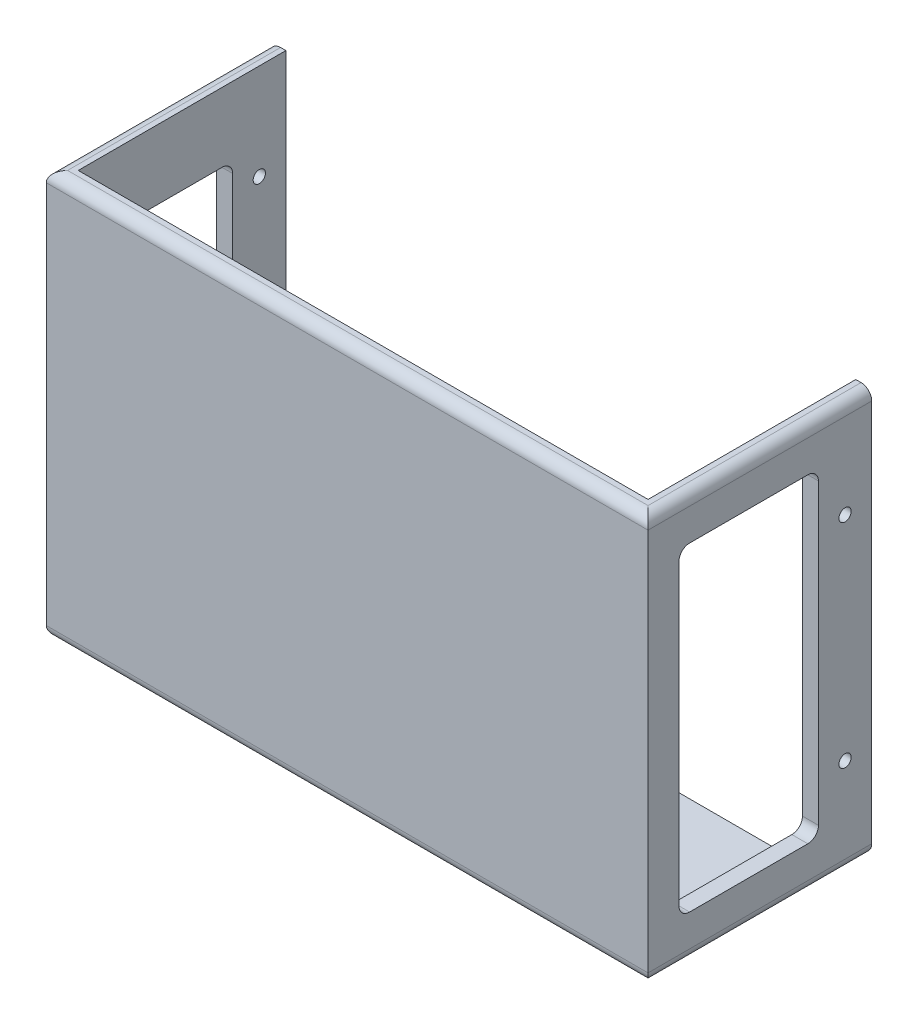
ISO-10303-21;
HEADER;
FILE_DESCRIPTION(('STEP AP214'),'2;1');
FILE_NAME('part.step','',(''),(''),'','','');
FILE_SCHEMA(('AUTOMOTIVE_DESIGN { 1 0 10303 214 1 1 1 1 }'));
ENDSEC;
DATA;
#1=APPLICATION_CONTEXT('core data for automotive mechanical design processes');
#2=APPLICATION_PROTOCOL_DEFINITION('international standard','automotive_design',2000,#1);
#3=PRODUCT_CONTEXT('',#1,'mechanical');
#4=PRODUCT('Part','Part','',(#3));
#5=PRODUCT_RELATED_PRODUCT_CATEGORY('part','',(#4));
#6=PRODUCT_DEFINITION_FORMATION('','',#4);
#7=PRODUCT_DEFINITION_CONTEXT('part definition',#1,'design');
#8=PRODUCT_DEFINITION('design','',#6,#7);
#9=PRODUCT_DEFINITION_SHAPE('','',#8);
#10=(LENGTH_UNIT() NAMED_UNIT(*) SI_UNIT(.MILLI.,.METRE.));
#11=(NAMED_UNIT(*) PLANE_ANGLE_UNIT() SI_UNIT($,.RADIAN.));
#12=(NAMED_UNIT(*) SI_UNIT($,.STERADIAN.) SOLID_ANGLE_UNIT());
#13=UNCERTAINTY_MEASURE_WITH_UNIT(LENGTH_MEASURE(1.E-05),#10,'distance_accuracy_value','');
#14=(GEOMETRIC_REPRESENTATION_CONTEXT(3) GLOBAL_UNCERTAINTY_ASSIGNED_CONTEXT((#13)) GLOBAL_UNIT_ASSIGNED_CONTEXT((#10,
#11,#12)) REPRESENTATION_CONTEXT('',''));
#15=CARTESIAN_POINT('',(0.,0.,0.));
#16=DIRECTION('',(0.,0.,1.));
#17=DIRECTION('',(1.,0.,0.));
#18=AXIS2_PLACEMENT_3D('',#15,#16,#17);
#19=CARTESIAN_POINT('',(-53.5,-35.,40.));
#20=DIRECTION('',(0.,1.,0.));
#21=DIRECTION('',(0.,0.,1.));
#22=AXIS2_PLACEMENT_3D('',#19,#20,#21);
#23=PLANE('',#22);
#24=DIRECTION('',(0.,0.,-1.));
#25=VECTOR('',#24,1.);
#26=CARTESIAN_POINT('',(53.5,-35.,40.));
#27=LINE('',#26,#25);
#28=CARTESIAN_POINT('',(53.5,-35.,39.));
#29=VERTEX_POINT('',#28);
#30=CARTESIAN_POINT('',(53.5,-35.,10.791278804793));
#31=VERTEX_POINT('',#30);
#32=EDGE_CURVE('E381',#29,#31,#27,.T.);
#33=ORIENTED_EDGE('',*,*,#32,.T.);
#34=DIRECTION('',(1.,0.,0.));
#35=VECTOR('',#34,1.);
#36=CARTESIAN_POINT('',(53.5,-35.,10.791278804793));
#37=LINE('',#36,#35);
#38=CARTESIAN_POINT('',(-53.5,-35.,10.791278804793));
#39=VERTEX_POINT('',#38);
#40=EDGE_CURVE('E266',#39,#31,#37,.T.);
#41=ORIENTED_EDGE('',*,*,#40,.F.);
#42=DIRECTION('',(0.,0.,-1.));
#43=VECTOR('',#42,1.);
#44=CARTESIAN_POINT('',(-53.5,-35.,40.));
#45=LINE('',#44,#43);
#46=CARTESIAN_POINT('',(-53.5,-35.,39.));
#47=VERTEX_POINT('',#46);
#48=EDGE_CURVE('E384',#47,#39,#45,.T.);
#49=ORIENTED_EDGE('',*,*,#48,.F.);
#50=DIRECTION('',(-1.,0.,0.));
#51=VECTOR('',#50,1.);
#52=CARTESIAN_POINT('',(-53.5,-35.,39.));
#53=LINE('',#52,#51);
#54=EDGE_CURVE('E296',#29,#47,#53,.T.);
#55=ORIENTED_EDGE('',*,*,#54,.F.);
#56=EDGE_LOOP('',(#33,#41,#49,#55));
#57=FACE_BOUND('',#56,.T.);
#58=ADVANCED_FACE('F46',(#57),#23,.T.);
#59=CARTESIAN_POINT('',(-56.5,-38.,40.));
#60=DIRECTION('',(1.,0.,0.));
#61=DIRECTION('',(0.,0.,-1.));
#62=AXIS2_PLACEMENT_3D('',#59,#60,#61);
#63=PLANE('',#62);
#64=CARTESIAN_POINT('',(-56.5,20.,5.));
#65=DIRECTION('',(1.,0.,0.));
#66=DIRECTION('',(0.,0.,-1.));
#67=AXIS2_PLACEMENT_3D('',#64,#65,#66);
#68=CIRCLE('',#67,1.15);
#69=CARTESIAN_POINT('',(-56.5,20.,3.85));
#70=VERTEX_POINT('',#69);
#71=EDGE_CURVE('E570',#70,#70,#68,.T.);
#72=ORIENTED_EDGE('',*,*,#71,.T.);
#73=EDGE_LOOP('',(#72));
#74=FACE_BOUND('',#73,.T.);
#75=CARTESIAN_POINT('',(-56.5,-20.,5.));
#76=DIRECTION('',(1.,0.,0.));
#77=DIRECTION('',(0.,0.,-1.));
#78=AXIS2_PLACEMENT_3D('',#75,#76,#77);
#79=CIRCLE('',#78,1.15);
#80=CARTESIAN_POINT('',(-56.5,-20.,3.85));
#81=VERTEX_POINT('',#80);
#82=EDGE_CURVE('E590',#81,#81,#79,.T.);
#83=ORIENTED_EDGE('',*,*,#82,.T.);
#84=EDGE_LOOP('',(#83));
#85=FACE_BOUND('',#84,.T.);
#86=DIRECTION('',(0.,1.,0.));
#87=VECTOR('',#86,1.);
#88=CARTESIAN_POINT('',(-56.5,38.,39.));
#89=LINE('',#88,#87);
#90=CARTESIAN_POINT('',(-56.5,-23.,39.));
#91=VERTEX_POINT('',#90);
#92=CARTESIAN_POINT('',(-56.5,23.,39.));
#93=VERTEX_POINT('',#92);
#94=EDGE_CURVE('E283',#91,#93,#89,.T.);
#95=ORIENTED_EDGE('',*,*,#94,.F.);
#96=CARTESIAN_POINT('',(-56.5,-23.,37.));
#97=DIRECTION('',(1.,0.,0.));
#98=DIRECTION('',(0.,0.,-1.));
#99=AXIS2_PLACEMENT_3D('',#96,#97,#98);
#100=CIRCLE('',#99,2.);
#101=CARTESIAN_POINT('',(-56.5,-25.,37.));
#102=VERTEX_POINT('',#101);
#103=EDGE_CURVE('E11',#91,#102,#100,.T.);
#104=ORIENTED_EDGE('',*,*,#103,.T.);
#105=DIRECTION('',(0.,0.,1.));
#106=VECTOR('',#105,1.);
#107=CARTESIAN_POINT('',(-56.5,-25.,0.));
#108=LINE('',#107,#106);
#109=CARTESIAN_POINT('',(-56.5,-25.,12.));
#110=VERTEX_POINT('',#109);
#111=EDGE_CURVE('E313',#110,#102,#108,.T.);
#112=ORIENTED_EDGE('',*,*,#111,.F.);
#113=CARTESIAN_POINT('',(-56.5,-23.,12.));
#114=DIRECTION('',(1.,0.,0.));
#115=DIRECTION('',(0.,0.,-1.));
#116=AXIS2_PLACEMENT_3D('',#113,#114,#115);
#117=CIRCLE('',#116,2.);
#118=CARTESIAN_POINT('',(-56.5,-23.,10.));
#119=VERTEX_POINT('',#118);
#120=EDGE_CURVE('E543',#110,#119,#117,.T.);
#121=ORIENTED_EDGE('',*,*,#120,.T.);
#122=DIRECTION('',(0.,-1.,0.));
#123=VECTOR('',#122,1.);
#124=CARTESIAN_POINT('',(-56.5,0.,10.));
#125=LINE('',#124,#123);
#126=CARTESIAN_POINT('',(-56.5,23.,10.));
#127=VERTEX_POINT('',#126);
#128=EDGE_CURVE('E325',#127,#119,#125,.T.);
#129=ORIENTED_EDGE('',*,*,#128,.F.);
#130=CARTESIAN_POINT('',(-56.5,23.,12.));
#131=DIRECTION('',(1.,0.,0.));
#132=DIRECTION('',(0.,0.,-1.));
#133=AXIS2_PLACEMENT_3D('',#130,#131,#132);
#134=CIRCLE('',#133,2.);
#135=CARTESIAN_POINT('',(-56.5,25.,12.));
#136=VERTEX_POINT('',#135);
#137=EDGE_CURVE('E531',#127,#136,#134,.T.);
#138=ORIENTED_EDGE('',*,*,#137,.T.);
#139=DIRECTION('',(0.,0.,1.));
#140=VECTOR('',#139,1.);
#141=CARTESIAN_POINT('',(-56.5,25.,0.));
#142=LINE('',#141,#140);
#143=CARTESIAN_POINT('',(-56.5,25.,37.));
#144=VERTEX_POINT('',#143);
#145=EDGE_CURVE('E307',#136,#144,#142,.T.);
#146=ORIENTED_EDGE('',*,*,#145,.T.);
#147=CARTESIAN_POINT('',(-56.5,23.,37.));
#148=DIRECTION('',(1.,0.,0.));
#149=DIRECTION('',(0.,0.,-1.));
#150=AXIS2_PLACEMENT_3D('',#147,#148,#149);
#151=CIRCLE('',#150,2.);
#152=EDGE_CURVE('E540',#144,#93,#151,.T.);
#153=ORIENTED_EDGE('',*,*,#152,.T.);
#154=EDGE_LOOP('',(#95,#104,#112,#121,#129,#138,#146,#153));
#155=FACE_BOUND('',#154,.T.);
#156=DIRECTION('',(0.,-1.,0.));
#157=VECTOR('',#156,1.);
#158=CARTESIAN_POINT('',(-56.5,38.,42.));
#159=LINE('',#158,#157);
#160=CARTESIAN_POINT('',(-56.5,36.,42.));
#161=VERTEX_POINT('',#160);
#162=CARTESIAN_POINT('',(-56.5,-36.,42.));
#163=VERTEX_POINT('',#162);
#164=EDGE_CURVE('E367',#161,#163,#159,.T.);
#165=ORIENTED_EDGE('',*,*,#164,.F.);
#166=DIRECTION('',(0.,0.,-1.));
#167=VECTOR('',#166,1.);
#168=CARTESIAN_POINT('',(-56.5,36.,40.));
#169=LINE('',#168,#167);
#170=CARTESIAN_POINT('',(-56.5,36.,0.));
#171=VERTEX_POINT('',#170);
#172=EDGE_CURVE('E491',#161,#171,#169,.T.);
#173=ORIENTED_EDGE('',*,*,#172,.T.);
#174=DIRECTION('',(0.,-1.,0.));
#175=VECTOR('',#174,1.);
#176=CARTESIAN_POINT('',(-56.5,-38.,0.));
#177=LINE('',#176,#175);
#178=CARTESIAN_POINT('',(-56.5,-36.,0.));
#179=VERTEX_POINT('',#178);
#180=EDGE_CURVE('E388',#171,#179,#177,.T.);
#181=ORIENTED_EDGE('',*,*,#180,.T.);
#182=DIRECTION('',(0.,0.,-1.));
#183=VECTOR('',#182,1.);
#184=CARTESIAN_POINT('',(-56.5,-36.,40.));
#185=LINE('',#184,#183);
#186=EDGE_CURVE('E488',#179,#163,#185,.F.);
#187=ORIENTED_EDGE('',*,*,#186,.T.);
#188=EDGE_LOOP('',(#165,#173,#181,#187));
#189=FACE_BOUND('',#188,.T.);
#190=ADVANCED_FACE('F685',(#74,#85,#155,#189),#63,.F.);
#191=CARTESIAN_POINT('',(0.,0.,0.));
#192=DIRECTION('',(0.,0.,-1.));
#193=DIRECTION('',(-1.,0.,0.));
#194=AXIS2_PLACEMENT_3D('',#191,#192,#193);
#195=PLANE('',#194);
#196=ORIENTED_EDGE('',*,*,#180,.F.);
#197=CARTESIAN_POINT('',(-54.5,36.,0.));
#198=DIRECTION('',(0.,0.,-1.));
#199=DIRECTION('',(-1.,0.,0.));
#200=AXIS2_PLACEMENT_3D('',#197,#198,#199);
#201=CIRCLE('',#200,2.);
#202=CARTESIAN_POINT('',(-54.5,38.,0.));
#203=VERTEX_POINT('',#202);
#204=EDGE_CURVE('E497',#171,#203,#201,.T.);
#205=ORIENTED_EDGE('',*,*,#204,.T.);
#206=DIRECTION('',(-1.,0.,0.));
#207=VECTOR('',#206,1.);
#208=CARTESIAN_POINT('',(-56.5,38.,0.));
#209=LINE('',#208,#207);
#210=CARTESIAN_POINT('',(-53.5,38.,0.));
#211=VERTEX_POINT('',#210);
#212=EDGE_CURVE('E400',#211,#203,#209,.T.);
#213=ORIENTED_EDGE('',*,*,#212,.F.);
#214=DIRECTION('',(0.,-1.,0.));
#215=VECTOR('',#214,1.);
#216=CARTESIAN_POINT('',(-53.5,-35.,0.));
#217=LINE('',#216,#215);
#218=CARTESIAN_POINT('',(-53.5,-38.,0.));
#219=VERTEX_POINT('',#218);
#220=EDGE_CURVE('E377',#211,#219,#217,.T.);
#221=ORIENTED_EDGE('',*,*,#220,.T.);
#222=DIRECTION('',(1.,0.,0.));
#223=VECTOR('',#222,1.);
#224=CARTESIAN_POINT('',(-56.5,-38.,0.));
#225=LINE('',#224,#223);
#226=CARTESIAN_POINT('',(-54.5,-38.,0.));
#227=VERTEX_POINT('',#226);
#228=EDGE_CURVE('E393',#227,#219,#225,.T.);
#229=ORIENTED_EDGE('',*,*,#228,.F.);
#230=CARTESIAN_POINT('',(-54.5,-36.,0.));
#231=DIRECTION('',(0.,0.,-1.));
#232=DIRECTION('',(-1.,0.,0.));
#233=AXIS2_PLACEMENT_3D('',#230,#231,#232);
#234=CIRCLE('',#233,2.);
#235=EDGE_CURVE('E494',#227,#179,#234,.T.);
#236=ORIENTED_EDGE('',*,*,#235,.T.);
#237=EDGE_LOOP('',(#196,#205,#213,#221,#229,#236));
#238=FACE_BOUND('',#237,.T.);
#239=ADVANCED_FACE('F647',(#238),#195,.T.);
#240=CARTESIAN_POINT('',(56.5,-38.,40.));
#241=DIRECTION('',(-1.,0.,0.));
#242=DIRECTION('',(0.,0.,1.));
#243=AXIS2_PLACEMENT_3D('',#240,#241,#242);
#244=PLANE('',#243);
#245=CARTESIAN_POINT('',(56.5,20.,5.));
#246=DIRECTION('',(1.,0.,0.));
#247=DIRECTION('',(0.,0.,-1.));
#248=AXIS2_PLACEMENT_3D('',#245,#246,#247);
#249=CIRCLE('',#248,1.15);
#250=CARTESIAN_POINT('',(56.5,20.,3.85));
#251=VERTEX_POINT('',#250);
#252=EDGE_CURVE('E578',#251,#251,#249,.T.);
#253=ORIENTED_EDGE('',*,*,#252,.F.);
#254=EDGE_LOOP('',(#253));
#255=FACE_BOUND('',#254,.T.);
#256=CARTESIAN_POINT('',(56.5,-20.,5.));
#257=DIRECTION('',(1.,0.,0.));
#258=DIRECTION('',(0.,0.,-1.));
#259=AXIS2_PLACEMENT_3D('',#256,#257,#258);
#260=CIRCLE('',#259,1.15);
#261=CARTESIAN_POINT('',(56.5,-20.,3.85));
#262=VERTEX_POINT('',#261);
#263=EDGE_CURVE('E584',#262,#262,#260,.T.);
#264=ORIENTED_EDGE('',*,*,#263,.F.);
#265=EDGE_LOOP('',(#264));
#266=FACE_BOUND('',#265,.T.);
#267=DIRECTION('',(0.,-1.,0.));
#268=VECTOR('',#267,1.);
#269=CARTESIAN_POINT('',(56.5,0.,36.200451213477));
#270=LINE('',#269,#268);
#271=CARTESIAN_POINT('',(56.5,28.,36.200451213477));
#272=VERTEX_POINT('',#271);
#273=CARTESIAN_POINT('',(56.5,-28.,36.200451213477));
#274=VERTEX_POINT('',#273);
#275=EDGE_CURVE('E352',#272,#274,#270,.T.);
#276=ORIENTED_EDGE('',*,*,#275,.F.);
#277=CARTESIAN_POINT('',(56.5,28.,34.200451213477));
#278=DIRECTION('',(-1.,0.,0.));
#279=DIRECTION('',(0.,0.,1.));
#280=AXIS2_PLACEMENT_3D('',#277,#278,#279);
#281=CIRCLE('',#280,2.);
#282=CARTESIAN_POINT('',(56.5,30.,34.200451213477));
#283=VERTEX_POINT('',#282);
#284=EDGE_CURVE('E513',#272,#283,#281,.T.);
#285=ORIENTED_EDGE('',*,*,#284,.T.);
#286=DIRECTION('',(0.,0.,1.));
#287=VECTOR('',#286,1.);
#288=CARTESIAN_POINT('',(56.5,30.,0.));
#289=LINE('',#288,#287);
#290=CARTESIAN_POINT('',(56.5,30.,12.));
#291=VERTEX_POINT('',#290);
#292=EDGE_CURVE('E321',#291,#283,#289,.T.);
#293=ORIENTED_EDGE('',*,*,#292,.F.);
#294=CARTESIAN_POINT('',(56.5,28.,12.));
#295=DIRECTION('',(-1.,0.,0.));
#296=DIRECTION('',(0.,0.,1.));
#297=AXIS2_PLACEMENT_3D('',#294,#295,#296);
#298=CIRCLE('',#297,2.);
#299=CARTESIAN_POINT('',(56.5,28.,10.));
#300=VERTEX_POINT('',#299);
#301=EDGE_CURVE('E507',#291,#300,#298,.T.);
#302=ORIENTED_EDGE('',*,*,#301,.T.);
#303=DIRECTION('',(0.,-1.,0.));
#304=VECTOR('',#303,1.);
#305=CARTESIAN_POINT('',(56.5,0.,10.));
#306=LINE('',#305,#304);
#307=CARTESIAN_POINT('',(56.5,-28.,9.99999999999999));
#308=VERTEX_POINT('',#307);
#309=EDGE_CURVE('E337',#300,#308,#306,.T.);
#310=ORIENTED_EDGE('',*,*,#309,.T.);
#311=CARTESIAN_POINT('',(56.5,-28.,12.));
#312=DIRECTION('',(-1.,0.,0.));
#313=DIRECTION('',(0.,0.,1.));
#314=AXIS2_PLACEMENT_3D('',#311,#312,#313);
#315=CIRCLE('',#314,2.);
#316=CARTESIAN_POINT('',(56.5,-30.,12.));
#317=VERTEX_POINT('',#316);
#318=EDGE_CURVE('E525',#308,#317,#315,.T.);
#319=ORIENTED_EDGE('',*,*,#318,.T.);
#320=DIRECTION('',(0.,0.,1.));
#321=VECTOR('',#320,1.);
#322=CARTESIAN_POINT('',(56.5,-30.,0.));
#323=LINE('',#322,#321);
#324=CARTESIAN_POINT('',(56.5,-30.,34.200451213477));
#325=VERTEX_POINT('',#324);
#326=EDGE_CURVE('E356',#317,#325,#323,.T.);
#327=ORIENTED_EDGE('',*,*,#326,.T.);
#328=CARTESIAN_POINT('',(56.5,-28.,34.200451213477));
#329=DIRECTION('',(-1.,0.,0.));
#330=DIRECTION('',(0.,0.,1.));
#331=AXIS2_PLACEMENT_3D('',#328,#329,#330);
#332=CIRCLE('',#331,2.);
#333=EDGE_CURVE('E519',#325,#274,#332,.T.);
#334=ORIENTED_EDGE('',*,*,#333,.T.);
#335=EDGE_LOOP('',(#276,#285,#293,#302,#310,#319,#327,#334));
#336=FACE_BOUND('',#335,.T.);
#337=DIRECTION('',(0.,1.,0.));
#338=VECTOR('',#337,1.);
#339=CARTESIAN_POINT('',(56.5,-38.,0.));
#340=LINE('',#339,#338);
#341=CARTESIAN_POINT('',(56.5,-36.,0.));
#342=VERTEX_POINT('',#341);
#343=CARTESIAN_POINT('',(56.5,36.,0.));
#344=VERTEX_POINT('',#343);
#345=EDGE_CURVE('E396',#342,#344,#340,.T.);
#346=ORIENTED_EDGE('',*,*,#345,.T.);
#347=DIRECTION('',(0.,0.,-1.));
#348=VECTOR('',#347,1.);
#349=CARTESIAN_POINT('',(56.5,36.,40.));
#350=LINE('',#349,#348);
#351=CARTESIAN_POINT('',(56.5,36.,42.));
#352=VERTEX_POINT('',#351);
#353=EDGE_CURVE('E485',#344,#352,#350,.F.);
#354=ORIENTED_EDGE('',*,*,#353,.T.);
#355=DIRECTION('',(0.,1.,0.));
#356=VECTOR('',#355,1.);
#357=CARTESIAN_POINT('',(56.5,38.,42.));
#358=LINE('',#357,#356);
#359=CARTESIAN_POINT('',(56.5,-36.,42.));
#360=VERTEX_POINT('',#359);
#361=EDGE_CURVE('E371',#360,#352,#358,.T.);
#362=ORIENTED_EDGE('',*,*,#361,.F.);
#363=DIRECTION('',(0.,0.,-1.));
#364=VECTOR('',#363,1.);
#365=CARTESIAN_POINT('',(56.5,-36.,40.));
#366=LINE('',#365,#364);
#367=EDGE_CURVE('E482',#360,#342,#366,.T.);
#368=ORIENTED_EDGE('',*,*,#367,.T.);
#369=EDGE_LOOP('',(#346,#354,#362,#368));
#370=FACE_BOUND('',#369,.T.);
#371=ADVANCED_FACE('F632',(#255,#266,#336,#370),#244,.F.);
#372=CARTESIAN_POINT('',(53.5,-35.,40.));
#373=DIRECTION('',(-1.,0.,0.));
#374=DIRECTION('',(0.,0.,1.));
#375=AXIS2_PLACEMENT_3D('',#372,#373,#374);
#376=PLANE('',#375);
#377=CARTESIAN_POINT('',(53.5,20.,5.));
#378=DIRECTION('',(-1.,0.,0.));
#379=DIRECTION('',(0.,0.,1.));
#380=AXIS2_PLACEMENT_3D('',#377,#378,#379);
#381=CIRCLE('',#380,1.15);
#382=CARTESIAN_POINT('',(53.5,20.,6.15));
#383=VERTEX_POINT('',#382);
#384=EDGE_CURVE('E563',#383,#383,#381,.T.);
#385=ORIENTED_EDGE('',*,*,#384,.F.);
#386=EDGE_LOOP('',(#385));
#387=FACE_BOUND('',#386,.T.);
#388=CARTESIAN_POINT('',(53.5,-20.,5.));
#389=DIRECTION('',(-1.,0.,0.));
#390=DIRECTION('',(0.,0.,1.));
#391=AXIS2_PLACEMENT_3D('',#388,#389,#390);
#392=CIRCLE('',#391,1.15);
#393=CARTESIAN_POINT('',(53.5,-20.,6.15));
#394=VERTEX_POINT('',#393);
#395=EDGE_CURVE('E569',#394,#394,#392,.T.);
#396=ORIENTED_EDGE('',*,*,#395,.F.);
#397=EDGE_LOOP('',(#396));
#398=FACE_BOUND('',#397,.T.);
#399=DIRECTION('',(0.,-1.,0.));
#400=VECTOR('',#399,1.);
#401=CARTESIAN_POINT('',(53.5,-35.,39.));
#402=LINE('',#401,#400);
#403=CARTESIAN_POINT('',(53.5,38.,39.));
#404=VERTEX_POINT('',#403);
#405=EDGE_CURVE('E300',#404,#29,#402,.T.);
#406=ORIENTED_EDGE('',*,*,#405,.F.);
#407=DIRECTION('',(0.,0.,-1.));
#408=VECTOR('',#407,1.);
#409=CARTESIAN_POINT('',(53.5,38.,0.));
#410=LINE('',#409,#408);
#411=CARTESIAN_POINT('',(53.5,38.,0.));
#412=VERTEX_POINT('',#411);
#413=EDGE_CURVE('E304',#404,#412,#410,.T.);
#414=ORIENTED_EDGE('',*,*,#413,.T.);
#415=DIRECTION('',(0.,1.,0.));
#416=VECTOR('',#415,1.);
#417=CARTESIAN_POINT('',(53.5,-35.,0.));
#418=LINE('',#417,#416);
#419=CARTESIAN_POINT('',(53.5,-38.,0.));
#420=VERTEX_POINT('',#419);
#421=EDGE_CURVE('E254',#420,#412,#418,.T.);
#422=ORIENTED_EDGE('',*,*,#421,.F.);
#423=DIRECTION('',(0.,0.,-1.));
#424=VECTOR('',#423,1.);
#425=CARTESIAN_POINT('',(53.5,-38.,0.));
#426=LINE('',#425,#424);
#427=CARTESIAN_POINT('',(53.5,-38.,10.791278804793));
#428=VERTEX_POINT('',#427);
#429=EDGE_CURVE('E245',#428,#420,#426,.T.);
#430=ORIENTED_EDGE('',*,*,#429,.F.);
#431=DIRECTION('',(0.,-1.,0.));
#432=VECTOR('',#431,1.);
#433=CARTESIAN_POINT('',(53.5,-35.,10.791278804793));
#434=LINE('',#433,#432);
#435=EDGE_CURVE('E250',#31,#428,#434,.T.);
#436=ORIENTED_EDGE('',*,*,#435,.F.);
#437=ORIENTED_EDGE('',*,*,#32,.F.);
#438=EDGE_LOOP('',(#406,#414,#422,#430,#436,#437));
#439=FACE_BOUND('',#438,.T.);
#440=DIRECTION('',(0.,-1.,0.));
#441=VECTOR('',#440,1.);
#442=CARTESIAN_POINT('',(53.5,0.,10.));
#443=LINE('',#442,#441);
#444=CARTESIAN_POINT('',(53.5,28.,10.));
#445=VERTEX_POINT('',#444);
#446=CARTESIAN_POINT('',(53.5,-28.,9.99999999999999));
#447=VERTEX_POINT('',#446);
#448=EDGE_CURVE('E345',#445,#447,#443,.T.);
#449=ORIENTED_EDGE('',*,*,#448,.F.);
#450=CARTESIAN_POINT('',(53.5,28.,12.));
#451=DIRECTION('',(-1.,0.,0.));
#452=DIRECTION('',(0.,0.,1.));
#453=AXIS2_PLACEMENT_3D('',#450,#451,#452);
#454=CIRCLE('',#453,2.);
#455=CARTESIAN_POINT('',(53.5,30.,12.));
#456=VERTEX_POINT('',#455);
#457=EDGE_CURVE('E510',#445,#456,#454,.F.);
#458=ORIENTED_EDGE('',*,*,#457,.T.);
#459=DIRECTION('',(0.,0.,1.));
#460=VECTOR('',#459,1.);
#461=CARTESIAN_POINT('',(53.5,30.,0.));
#462=LINE('',#461,#460);
#463=CARTESIAN_POINT('',(53.5,30.,34.200451213477));
#464=VERTEX_POINT('',#463);
#465=EDGE_CURVE('E332',#456,#464,#462,.T.);
#466=ORIENTED_EDGE('',*,*,#465,.T.);
#467=CARTESIAN_POINT('',(53.5,28.,34.200451213477));
#468=DIRECTION('',(-1.,0.,0.));
#469=DIRECTION('',(0.,0.,1.));
#470=AXIS2_PLACEMENT_3D('',#467,#468,#469);
#471=CIRCLE('',#470,2.);
#472=CARTESIAN_POINT('',(53.5,28.,36.200451213477));
#473=VERTEX_POINT('',#472);
#474=EDGE_CURVE('E516',#464,#473,#471,.F.);
#475=ORIENTED_EDGE('',*,*,#474,.T.);
#476=DIRECTION('',(0.,-1.,0.));
#477=VECTOR('',#476,1.);
#478=CARTESIAN_POINT('',(53.5,0.,36.200451213477));
#479=LINE('',#478,#477);
#480=CARTESIAN_POINT('',(53.5,-28.,36.200451213477));
#481=VERTEX_POINT('',#480);
#482=EDGE_CURVE('E336',#473,#481,#479,.T.);
#483=ORIENTED_EDGE('',*,*,#482,.T.);
#484=CARTESIAN_POINT('',(53.5,-28.,34.200451213477));
#485=DIRECTION('',(-1.,0.,0.));
#486=DIRECTION('',(0.,0.,1.));
#487=AXIS2_PLACEMENT_3D('',#484,#485,#486);
#488=CIRCLE('',#487,2.);
#489=CARTESIAN_POINT('',(53.5,-30.,34.200451213477));
#490=VERTEX_POINT('',#489);
#491=EDGE_CURVE('E522',#481,#490,#488,.F.);
#492=ORIENTED_EDGE('',*,*,#491,.T.);
#493=DIRECTION('',(0.,0.,1.));
#494=VECTOR('',#493,1.);
#495=CARTESIAN_POINT('',(53.5,-30.,0.));
#496=LINE('',#495,#494);
#497=CARTESIAN_POINT('',(53.5,-30.,12.));
#498=VERTEX_POINT('',#497);
#499=EDGE_CURVE('E341',#498,#490,#496,.T.);
#500=ORIENTED_EDGE('',*,*,#499,.F.);
#501=CARTESIAN_POINT('',(53.5,-28.,12.));
#502=DIRECTION('',(-1.,0.,0.));
#503=DIRECTION('',(0.,0.,1.));
#504=AXIS2_PLACEMENT_3D('',#501,#502,#503);
#505=CIRCLE('',#504,2.);
#506=EDGE_CURVE('E528',#498,#447,#505,.F.);
#507=ORIENTED_EDGE('',*,*,#506,.T.);
#508=EDGE_LOOP('',(#449,#458,#466,#475,#483,#492,#500,#507));
#509=FACE_BOUND('',#508,.T.);
#510=ADVANCED_FACE('F247',(#387,#398,#439,#509),#376,.T.);
#511=CARTESIAN_POINT('',(-53.5,-35.,40.));
#512=DIRECTION('',(1.,0.,0.));
#513=DIRECTION('',(0.,0.,-1.));
#514=AXIS2_PLACEMENT_3D('',#511,#512,#513);
#515=PLANE('',#514);
#516=CARTESIAN_POINT('',(-53.5,20.,5.));
#517=DIRECTION('',(1.,0.,0.));
#518=DIRECTION('',(0.,0.,-1.));
#519=AXIS2_PLACEMENT_3D('',#516,#517,#518);
#520=CIRCLE('',#519,1.15);
#521=CARTESIAN_POINT('',(-53.5,20.,3.85));
#522=VERTEX_POINT('',#521);
#523=EDGE_CURVE('E50',#522,#522,#520,.T.);
#524=ORIENTED_EDGE('',*,*,#523,.F.);
#525=EDGE_LOOP('',(#524));
#526=FACE_BOUND('',#525,.T.);
#527=CARTESIAN_POINT('',(-53.5,-20.,5.));
#528=DIRECTION('',(1.,0.,0.));
#529=DIRECTION('',(0.,0.,-1.));
#530=AXIS2_PLACEMENT_3D('',#527,#528,#529);
#531=CIRCLE('',#530,1.15);
#532=CARTESIAN_POINT('',(-53.5,-20.,3.85));
#533=VERTEX_POINT('',#532);
#534=EDGE_CURVE('E566',#533,#533,#531,.T.);
#535=ORIENTED_EDGE('',*,*,#534,.F.);
#536=EDGE_LOOP('',(#535));
#537=FACE_BOUND('',#536,.T.);
#538=DIRECTION('',(0.,1.,0.));
#539=VECTOR('',#538,1.);
#540=CARTESIAN_POINT('',(-53.5,-35.,39.));
#541=LINE('',#540,#539);
#542=CARTESIAN_POINT('',(-53.5,-23.,39.));
#543=VERTEX_POINT('',#542);
#544=EDGE_CURVE('E295',#47,#543,#541,.T.);
#545=ORIENTED_EDGE('',*,*,#544,.F.);
#546=ORIENTED_EDGE('',*,*,#48,.T.);
#547=DIRECTION('',(0.,1.,0.));
#548=VECTOR('',#547,1.);
#549=CARTESIAN_POINT('',(-53.5,-35.,10.791278804793));
#550=LINE('',#549,#548);
#551=CARTESIAN_POINT('',(-53.5,-38.,10.791278804793));
#552=VERTEX_POINT('',#551);
#553=EDGE_CURVE('E275',#552,#39,#550,.T.);
#554=ORIENTED_EDGE('',*,*,#553,.F.);
#555=DIRECTION('',(0.,0.,1.));
#556=VECTOR('',#555,1.);
#557=CARTESIAN_POINT('',(-53.5,-38.,0.));
#558=LINE('',#557,#556);
#559=EDGE_CURVE('E259',#219,#552,#558,.T.);
#560=ORIENTED_EDGE('',*,*,#559,.F.);
#561=ORIENTED_EDGE('',*,*,#220,.F.);
#562=DIRECTION('',(0.,0.,-1.));
#563=VECTOR('',#562,1.);
#564=CARTESIAN_POINT('',(-53.5,38.,0.));
#565=LINE('',#564,#563);
#566=CARTESIAN_POINT('',(-53.5,38.,39.));
#567=VERTEX_POINT('',#566);
#568=EDGE_CURVE('E258',#567,#211,#565,.T.);
#569=ORIENTED_EDGE('',*,*,#568,.F.);
#570=CARTESIAN_POINT('',(-53.5,23.,39.));
#571=VERTEX_POINT('',#570);
#572=EDGE_CURVE('E291',#571,#567,#541,.T.);
#573=ORIENTED_EDGE('',*,*,#572,.F.);
#574=CARTESIAN_POINT('',(-53.5,23.,37.));
#575=DIRECTION('',(1.,0.,0.));
#576=DIRECTION('',(0.,0.,-1.));
#577=AXIS2_PLACEMENT_3D('',#574,#575,#576);
#578=CIRCLE('',#577,2.);
#579=CARTESIAN_POINT('',(-53.5,25.,37.));
#580=VERTEX_POINT('',#579);
#581=EDGE_CURVE('E537',#571,#580,#578,.F.);
#582=ORIENTED_EDGE('',*,*,#581,.T.);
#583=DIRECTION('',(0.,0.,1.));
#584=VECTOR('',#583,1.);
#585=CARTESIAN_POINT('',(-53.5,25.,0.));
#586=LINE('',#585,#584);
#587=CARTESIAN_POINT('',(-53.5,25.,12.));
#588=VERTEX_POINT('',#587);
#589=EDGE_CURVE('E308',#588,#580,#586,.T.);
#590=ORIENTED_EDGE('',*,*,#589,.F.);
#591=CARTESIAN_POINT('',(-53.5,23.,12.));
#592=DIRECTION('',(1.,0.,0.));
#593=DIRECTION('',(0.,0.,-1.));
#594=AXIS2_PLACEMENT_3D('',#591,#592,#593);
#595=CIRCLE('',#594,2.);
#596=CARTESIAN_POINT('',(-53.5,23.,10.));
#597=VERTEX_POINT('',#596);
#598=EDGE_CURVE('E534',#588,#597,#595,.F.);
#599=ORIENTED_EDGE('',*,*,#598,.T.);
#600=DIRECTION('',(0.,-1.,0.));
#601=VECTOR('',#600,1.);
#602=CARTESIAN_POINT('',(-53.5,0.,10.));
#603=LINE('',#602,#601);
#604=CARTESIAN_POINT('',(-53.5,-23.,10.));
#605=VERTEX_POINT('',#604);
#606=EDGE_CURVE('E312',#597,#605,#603,.T.);
#607=ORIENTED_EDGE('',*,*,#606,.T.);
#608=CARTESIAN_POINT('',(-53.5,-23.,12.));
#609=DIRECTION('',(1.,0.,0.));
#610=DIRECTION('',(0.,0.,-1.));
#611=AXIS2_PLACEMENT_3D('',#608,#609,#610);
#612=CIRCLE('',#611,2.);
#613=CARTESIAN_POINT('',(-53.5,-25.,12.));
#614=VERTEX_POINT('',#613);
#615=EDGE_CURVE('E546',#605,#614,#612,.F.);
#616=ORIENTED_EDGE('',*,*,#615,.T.);
#617=DIRECTION('',(0.,0.,1.));
#618=VECTOR('',#617,1.);
#619=CARTESIAN_POINT('',(-53.5,-25.,0.));
#620=LINE('',#619,#618);
#621=CARTESIAN_POINT('',(-53.5,-25.,37.));
#622=VERTEX_POINT('',#621);
#623=EDGE_CURVE('E317',#614,#622,#620,.T.);
#624=ORIENTED_EDGE('',*,*,#623,.T.);
#625=CARTESIAN_POINT('',(-53.5,-23.,37.));
#626=DIRECTION('',(1.,0.,0.));
#627=DIRECTION('',(0.,0.,-1.));
#628=AXIS2_PLACEMENT_3D('',#625,#626,#627);
#629=CIRCLE('',#628,2.);
#630=EDGE_CURVE('E56',#622,#543,#629,.F.);
#631=ORIENTED_EDGE('',*,*,#630,.T.);
#632=EDGE_LOOP('',(#545,#546,#554,#560,#561,#569,#573,#582,#590,#599,#607,#616,#624,#631));
#633=FACE_BOUND('',#632,.T.);
#634=ADVANCED_FACE('F604',(#526,#537,#633),#515,.T.);
#635=CARTESIAN_POINT('',(54.5,38.,0.));
#636=VERTEX_POINT('',#635);
#637=EDGE_CURVE('E401',#636,#412,#209,.T.);
#638=ORIENTED_EDGE('',*,*,#637,.F.);
#639=CARTESIAN_POINT('',(54.5,36.,0.));
#640=DIRECTION('',(0.,0.,-1.));
#641=DIRECTION('',(-1.,0.,0.));
#642=AXIS2_PLACEMENT_3D('',#639,#640,#641);
#643=CIRCLE('',#642,2.);
#644=EDGE_CURVE('E479',#636,#344,#643,.T.);
#645=ORIENTED_EDGE('',*,*,#644,.T.);
#646=ORIENTED_EDGE('',*,*,#345,.F.);
#647=CARTESIAN_POINT('',(54.5,-36.,0.));
#648=DIRECTION('',(0.,0.,-1.));
#649=DIRECTION('',(-1.,0.,0.));
#650=AXIS2_PLACEMENT_3D('',#647,#648,#649);
#651=CIRCLE('',#650,2.);
#652=CARTESIAN_POINT('',(54.5,-38.,0.));
#653=VERTEX_POINT('',#652);
#654=EDGE_CURVE('E476',#342,#653,#651,.T.);
#655=ORIENTED_EDGE('',*,*,#654,.T.);
#656=EDGE_CURVE('E392',#420,#653,#225,.T.);
#657=ORIENTED_EDGE('',*,*,#656,.F.);
#658=ORIENTED_EDGE('',*,*,#421,.T.);
#659=EDGE_LOOP('',(#638,#645,#646,#655,#657,#658));
#660=FACE_BOUND('',#659,.T.);
#661=ADVANCED_FACE('F607',(#660),#195,.T.);
#662=CARTESIAN_POINT('',(-56.5,-38.,40.));
#663=DIRECTION('',(0.,1.,0.));
#664=DIRECTION('',(0.,0.,1.));
#665=AXIS2_PLACEMENT_3D('',#662,#663,#664);
#666=PLANE('',#665);
#667=DIRECTION('',(1.,0.,0.));
#668=VECTOR('',#667,1.);
#669=CARTESIAN_POINT('',(-56.5,-38.,40.));
#670=LINE('',#669,#668);
#671=CARTESIAN_POINT('',(54.5,-38.,40.));
#672=VERTEX_POINT('',#671);
#673=CARTESIAN_POINT('',(-54.5,-38.,40.));
#674=VERTEX_POINT('',#673);
#675=EDGE_CURVE('E64',#672,#674,#670,.F.);
#676=ORIENTED_EDGE('',*,*,#675,.T.);
#677=DIRECTION('',(0.,0.,-1.));
#678=VECTOR('',#677,1.);
#679=CARTESIAN_POINT('',(-54.5,-38.,40.));
#680=LINE('',#679,#678);
#681=EDGE_CURVE('E504',#674,#227,#680,.T.);
#682=ORIENTED_EDGE('',*,*,#681,.T.);
#683=ORIENTED_EDGE('',*,*,#228,.T.);
#684=ORIENTED_EDGE('',*,*,#559,.T.);
#685=DIRECTION('',(-1.,0.,0.));
#686=VECTOR('',#685,1.);
#687=CARTESIAN_POINT('',(53.5,-38.,10.791278804793));
#688=LINE('',#687,#686);
#689=EDGE_CURVE('E264',#428,#552,#688,.T.);
#690=ORIENTED_EDGE('',*,*,#689,.F.);
#691=ORIENTED_EDGE('',*,*,#429,.T.);
#692=ORIENTED_EDGE('',*,*,#656,.T.);
#693=DIRECTION('',(0.,0.,-1.));
#694=VECTOR('',#693,1.);
#695=CARTESIAN_POINT('',(54.5,-38.,40.));
#696=LINE('',#695,#694);
#697=EDGE_CURVE('E69',#653,#672,#696,.F.);
#698=ORIENTED_EDGE('',*,*,#697,.T.);
#699=EDGE_LOOP('',(#676,#682,#683,#684,#690,#691,#692,#698));
#700=FACE_BOUND('',#699,.T.);
#701=ADVANCED_FACE('F271',(#700),#666,.F.);
#702=CARTESIAN_POINT('',(-56.5,38.,40.));
#703=DIRECTION('',(0.,-1.,0.));
#704=DIRECTION('',(0.,0.,-1.));
#705=AXIS2_PLACEMENT_3D('',#702,#703,#704);
#706=PLANE('',#705);
#707=DIRECTION('',(-1.,0.,0.));
#708=VECTOR('',#707,1.);
#709=CARTESIAN_POINT('',(56.5,38.,40.));
#710=LINE('',#709,#708);
#711=CARTESIAN_POINT('',(-54.5,38.,40.));
#712=VERTEX_POINT('',#711);
#713=CARTESIAN_POINT('',(54.5,38.,40.));
#714=VERTEX_POINT('',#713);
#715=EDGE_CURVE('E470',#712,#714,#710,.F.);
#716=ORIENTED_EDGE('',*,*,#715,.T.);
#717=DIRECTION('',(0.,0.,-1.));
#718=VECTOR('',#717,1.);
#719=CARTESIAN_POINT('',(54.5,38.,40.));
#720=LINE('',#719,#718);
#721=EDGE_CURVE('E473',#714,#636,#720,.T.);
#722=ORIENTED_EDGE('',*,*,#721,.T.);
#723=ORIENTED_EDGE('',*,*,#637,.T.);
#724=ORIENTED_EDGE('',*,*,#413,.F.);
#725=DIRECTION('',(1.,0.,0.));
#726=VECTOR('',#725,1.);
#727=CARTESIAN_POINT('',(56.5,38.,39.));
#728=LINE('',#727,#726);
#729=EDGE_CURVE('E287',#567,#404,#728,.T.);
#730=ORIENTED_EDGE('',*,*,#729,.F.);
#731=ORIENTED_EDGE('',*,*,#568,.T.);
#732=ORIENTED_EDGE('',*,*,#212,.T.);
#733=DIRECTION('',(0.,0.,-1.));
#734=VECTOR('',#733,1.);
#735=CARTESIAN_POINT('',(-54.5,38.,40.));
#736=LINE('',#735,#734);
#737=EDGE_CURVE('E467',#203,#712,#736,.F.);
#738=ORIENTED_EDGE('',*,*,#737,.T.);
#739=EDGE_LOOP('',(#716,#722,#723,#724,#730,#731,#732,#738));
#740=FACE_BOUND('',#739,.T.);
#741=ADVANCED_FACE('F619',(#740),#706,.F.);
#742=CARTESIAN_POINT('',(0.,0.,42.));
#743=DIRECTION('',(0.,0.,1.));
#744=DIRECTION('',(1.,0.,0.));
#745=AXIS2_PLACEMENT_3D('',#742,#743,#744);
#746=PLANE('',#745);
#747=ORIENTED_EDGE('',*,*,#361,.T.);
#748=DIRECTION('',(-1.,0.,0.));
#749=VECTOR('',#748,1.);
#750=CARTESIAN_POINT('',(-56.5,36.,42.));
#751=LINE('',#750,#749);
#752=EDGE_CURVE('E463',#352,#161,#751,.T.);
#753=ORIENTED_EDGE('',*,*,#752,.T.);
#754=ORIENTED_EDGE('',*,*,#164,.T.);
#755=DIRECTION('',(1.,0.,0.));
#756=VECTOR('',#755,1.);
#757=CARTESIAN_POINT('',(56.5,-36.,42.));
#758=LINE('',#757,#756);
#759=EDGE_CURVE('E460',#163,#360,#758,.T.);
#760=ORIENTED_EDGE('',*,*,#759,.T.);
#761=EDGE_LOOP('',(#747,#753,#754,#760));
#762=FACE_BOUND('',#761,.T.);
#763=ADVANCED_FACE('F635',(#762),#746,.T.);
#764=CARTESIAN_POINT('',(53.5,30.,0.));
#765=DIRECTION('',(0.,1.,0.));
#766=DIRECTION('',(0.,0.,1.));
#767=AXIS2_PLACEMENT_3D('',#764,#765,#766);
#768=PLANE('',#767);
#769=ORIENTED_EDGE('',*,*,#465,.F.);
#770=DIRECTION('',(1.,0.,0.));
#771=VECTOR('',#770,1.);
#772=CARTESIAN_POINT('',(53.5,30.,12.));
#773=LINE('',#772,#771);
#774=EDGE_CURVE('E407',#456,#291,#773,.T.);
#775=ORIENTED_EDGE('',*,*,#774,.T.);
#776=ORIENTED_EDGE('',*,*,#292,.T.);
#777=DIRECTION('',(1.,0.,0.));
#778=VECTOR('',#777,1.);
#779=CARTESIAN_POINT('',(53.5,30.,34.200451213477));
#780=LINE('',#779,#778);
#781=EDGE_CURVE('E404',#283,#464,#780,.F.);
#782=ORIENTED_EDGE('',*,*,#781,.T.);
#783=EDGE_LOOP('',(#769,#775,#776,#782));
#784=FACE_BOUND('',#783,.T.);
#785=ADVANCED_FACE('F951',(#784),#768,.F.);
#786=CARTESIAN_POINT('',(53.5,0.,10.));
#787=DIRECTION('',(0.,0.,1.));
#788=DIRECTION('',(0.,-1.,0.));
#789=AXIS2_PLACEMENT_3D('',#786,#787,#788);
#790=PLANE('',#789);
#791=ORIENTED_EDGE('',*,*,#309,.F.);
#792=DIRECTION('',(1.,0.,0.));
#793=VECTOR('',#792,1.);
#794=CARTESIAN_POINT('',(53.5,28.,10.));
#795=LINE('',#794,#793);
#796=EDGE_CURVE('E415',#300,#445,#795,.F.);
#797=ORIENTED_EDGE('',*,*,#796,.T.);
#798=ORIENTED_EDGE('',*,*,#448,.T.);
#799=DIRECTION('',(1.,0.,0.));
#800=VECTOR('',#799,1.);
#801=CARTESIAN_POINT('',(56.5,-28.,9.99999999999999));
#802=LINE('',#801,#800);
#803=EDGE_CURVE('E411',#447,#308,#802,.T.);
#804=ORIENTED_EDGE('',*,*,#803,.T.);
#805=EDGE_LOOP('',(#791,#797,#798,#804));
#806=FACE_BOUND('',#805,.T.);
#807=ADVANCED_FACE('F942',(#806),#790,.T.);
#808=CARTESIAN_POINT('',(53.5,-30.,0.));
#809=DIRECTION('',(0.,1.,0.));
#810=DIRECTION('',(0.,0.,1.));
#811=AXIS2_PLACEMENT_3D('',#808,#809,#810);
#812=PLANE('',#811);
#813=ORIENTED_EDGE('',*,*,#499,.T.);
#814=DIRECTION('',(1.,0.,0.));
#815=VECTOR('',#814,1.);
#816=CARTESIAN_POINT('',(53.5,-30.,34.200451213477));
#817=LINE('',#816,#815);
#818=EDGE_CURVE('E428',#490,#325,#817,.T.);
#819=ORIENTED_EDGE('',*,*,#818,.T.);
#820=ORIENTED_EDGE('',*,*,#326,.F.);
#821=DIRECTION('',(1.,0.,0.));
#822=VECTOR('',#821,1.);
#823=CARTESIAN_POINT('',(53.5,-30.,12.));
#824=LINE('',#823,#822);
#825=EDGE_CURVE('E425',#317,#498,#824,.F.);
#826=ORIENTED_EDGE('',*,*,#825,.T.);
#827=EDGE_LOOP('',(#813,#819,#820,#826));
#828=FACE_BOUND('',#827,.T.);
#829=ADVANCED_FACE('F933',(#828),#812,.T.);
#830=CARTESIAN_POINT('',(53.5,0.,36.200451213477));
#831=DIRECTION('',(0.,0.,1.));
#832=DIRECTION('',(0.,-1.,0.));
#833=AXIS2_PLACEMENT_3D('',#830,#831,#832);
#834=PLANE('',#833);
#835=ORIENTED_EDGE('',*,*,#482,.F.);
#836=DIRECTION('',(1.,0.,0.));
#837=VECTOR('',#836,1.);
#838=CARTESIAN_POINT('',(56.5,28.,36.200451213477));
#839=LINE('',#838,#837);
#840=EDGE_CURVE('E421',#473,#272,#839,.T.);
#841=ORIENTED_EDGE('',*,*,#840,.T.);
#842=ORIENTED_EDGE('',*,*,#275,.T.);
#843=DIRECTION('',(1.,0.,0.));
#844=VECTOR('',#843,1.);
#845=CARTESIAN_POINT('',(53.5,-28.,36.200451213477));
#846=LINE('',#845,#844);
#847=EDGE_CURVE('E418',#274,#481,#846,.F.);
#848=ORIENTED_EDGE('',*,*,#847,.T.);
#849=EDGE_LOOP('',(#835,#841,#842,#848));
#850=FACE_BOUND('',#849,.T.);
#851=ADVANCED_FACE('F920',(#850),#834,.F.);
#852=CARTESIAN_POINT('',(-53.5,-25.,0.));
#853=DIRECTION('',(0.,-1.,0.));
#854=DIRECTION('',(0.,0.,-1.));
#855=AXIS2_PLACEMENT_3D('',#852,#853,#854);
#856=PLANE('',#855);
#857=ORIENTED_EDGE('',*,*,#623,.F.);
#858=DIRECTION('',(-1.,0.,0.));
#859=VECTOR('',#858,1.);
#860=CARTESIAN_POINT('',(-56.5,-25.,12.));
#861=LINE('',#860,#859);
#862=EDGE_CURVE('E456',#614,#110,#861,.T.);
#863=ORIENTED_EDGE('',*,*,#862,.T.);
#864=ORIENTED_EDGE('',*,*,#111,.T.);
#865=DIRECTION('',(1.,0.,0.));
#866=VECTOR('',#865,1.);
#867=CARTESIAN_POINT('',(-53.5,-25.,37.));
#868=LINE('',#867,#866);
#869=EDGE_CURVE('E452',#102,#622,#868,.T.);
#870=ORIENTED_EDGE('',*,*,#869,.T.);
#871=EDGE_LOOP('',(#857,#863,#864,#870));
#872=FACE_BOUND('',#871,.T.);
#873=ADVANCED_FACE('F678',(#872),#856,.F.);
#874=CARTESIAN_POINT('',(-53.5,0.,10.));
#875=DIRECTION('',(0.,0.,-1.));
#876=DIRECTION('',(0.,1.,0.));
#877=AXIS2_PLACEMENT_3D('',#874,#875,#876);
#878=PLANE('',#877);
#879=ORIENTED_EDGE('',*,*,#606,.F.);
#880=DIRECTION('',(-1.,0.,0.));
#881=VECTOR('',#880,1.);
#882=CARTESIAN_POINT('',(-53.5,23.,10.));
#883=LINE('',#882,#881);
#884=EDGE_CURVE('E435',#597,#127,#883,.T.);
#885=ORIENTED_EDGE('',*,*,#884,.T.);
#886=ORIENTED_EDGE('',*,*,#128,.T.);
#887=DIRECTION('',(-1.,0.,0.));
#888=VECTOR('',#887,1.);
#889=CARTESIAN_POINT('',(-53.5,-23.,10.));
#890=LINE('',#889,#888);
#891=EDGE_CURVE('E432',#119,#605,#890,.F.);
#892=ORIENTED_EDGE('',*,*,#891,.T.);
#893=EDGE_LOOP('',(#879,#885,#886,#892));
#894=FACE_BOUND('',#893,.T.);
#895=ADVANCED_FACE('F670',(#894),#878,.F.);
#896=CARTESIAN_POINT('',(-53.5,25.,0.));
#897=DIRECTION('',(0.,-1.,0.));
#898=DIRECTION('',(0.,0.,-1.));
#899=AXIS2_PLACEMENT_3D('',#896,#897,#898);
#900=PLANE('',#899);
#901=ORIENTED_EDGE('',*,*,#145,.F.);
#902=DIRECTION('',(-1.,0.,0.));
#903=VECTOR('',#902,1.);
#904=CARTESIAN_POINT('',(-53.5,25.,12.));
#905=LINE('',#904,#903);
#906=EDGE_CURVE('E442',#136,#588,#905,.F.);
#907=ORIENTED_EDGE('',*,*,#906,.T.);
#908=ORIENTED_EDGE('',*,*,#589,.T.);
#909=DIRECTION('',(1.,0.,0.));
#910=VECTOR('',#909,1.);
#911=CARTESIAN_POINT('',(-56.5,25.,37.));
#912=LINE('',#911,#910);
#913=EDGE_CURVE('E439',#580,#144,#912,.F.);
#914=ORIENTED_EDGE('',*,*,#913,.T.);
#915=EDGE_LOOP('',(#901,#907,#908,#914));
#916=FACE_BOUND('',#915,.T.);
#917=ADVANCED_FACE('F662',(#916),#900,.T.);
#918=CARTESIAN_POINT('',(0.,0.,39.));
#919=DIRECTION('',(0.,0.,-1.));
#920=DIRECTION('',(-1.,0.,0.));
#921=AXIS2_PLACEMENT_3D('',#918,#919,#920);
#922=PLANE('',#921);
#923=ORIENTED_EDGE('',*,*,#94,.T.);
#924=DIRECTION('',(1.,0.,0.));
#925=VECTOR('',#924,1.);
#926=CARTESIAN_POINT('',(-53.5,23.,39.));
#927=LINE('',#926,#925);
#928=EDGE_CURVE('E448',#93,#571,#927,.T.);
#929=ORIENTED_EDGE('',*,*,#928,.T.);
#930=ORIENTED_EDGE('',*,*,#572,.T.);
#931=ORIENTED_EDGE('',*,*,#729,.T.);
#932=ORIENTED_EDGE('',*,*,#405,.T.);
#933=ORIENTED_EDGE('',*,*,#54,.T.);
#934=ORIENTED_EDGE('',*,*,#544,.T.);
#935=DIRECTION('',(1.,0.,0.));
#936=VECTOR('',#935,1.);
#937=CARTESIAN_POINT('',(0.,-23.,39.));
#938=LINE('',#937,#936);
#939=EDGE_CURVE('E445',#543,#91,#938,.F.);
#940=ORIENTED_EDGE('',*,*,#939,.T.);
#941=EDGE_LOOP('',(#923,#929,#930,#931,#932,#933,#934,#940));
#942=FACE_BOUND('',#941,.T.);
#943=ADVANCED_FACE('F615',(#942),#922,.T.);
#944=CARTESIAN_POINT('',(0.,0.,10.791278804793));
#945=DIRECTION('',(0.,0.,-1.));
#946=DIRECTION('',(-1.,0.,0.));
#947=AXIS2_PLACEMENT_3D('',#944,#945,#946);
#948=PLANE('',#947);
#949=ORIENTED_EDGE('',*,*,#435,.T.);
#950=ORIENTED_EDGE('',*,*,#689,.T.);
#951=ORIENTED_EDGE('',*,*,#553,.T.);
#952=ORIENTED_EDGE('',*,*,#40,.T.);
#953=EDGE_LOOP('',(#949,#950,#951,#952));
#954=FACE_BOUND('',#953,.T.);
#955=ADVANCED_FACE('F263',(#954),#948,.T.);
#956=CARTESIAN_POINT('',(53.5,28.,12.));
#957=DIRECTION('',(1.,0.,0.));
#958=DIRECTION('',(0.,0.,-1.));
#959=AXIS2_PLACEMENT_3D('',#956,#957,#958);
#960=CYLINDRICAL_SURFACE('',#959,2.);
#961=ORIENTED_EDGE('',*,*,#457,.F.);
#962=ORIENTED_EDGE('',*,*,#796,.F.);
#963=ORIENTED_EDGE('',*,*,#301,.F.);
#964=ORIENTED_EDGE('',*,*,#774,.F.);
#965=EDGE_LOOP('',(#961,#962,#963,#964));
#966=FACE_BOUND('',#965,.T.);
#967=ADVANCED_FACE('F727',(#966),#960,.F.);
#968=CARTESIAN_POINT('',(53.5,28.,34.200451213477));
#969=DIRECTION('',(-1.,0.,0.));
#970=DIRECTION('',(0.,0.,1.));
#971=AXIS2_PLACEMENT_3D('',#968,#969,#970);
#972=CYLINDRICAL_SURFACE('',#971,2.);
#973=ORIENTED_EDGE('',*,*,#474,.F.);
#974=ORIENTED_EDGE('',*,*,#781,.F.);
#975=ORIENTED_EDGE('',*,*,#284,.F.);
#976=ORIENTED_EDGE('',*,*,#840,.F.);
#977=EDGE_LOOP('',(#973,#974,#975,#976));
#978=FACE_BOUND('',#977,.T.);
#979=ADVANCED_FACE('F730',(#978),#972,.F.);
#980=CARTESIAN_POINT('',(53.5,-28.,34.200451213477));
#981=DIRECTION('',(1.,0.,0.));
#982=DIRECTION('',(0.,0.,-1.));
#983=AXIS2_PLACEMENT_3D('',#980,#981,#982);
#984=CYLINDRICAL_SURFACE('',#983,2.);
#985=ORIENTED_EDGE('',*,*,#491,.F.);
#986=ORIENTED_EDGE('',*,*,#847,.F.);
#987=ORIENTED_EDGE('',*,*,#333,.F.);
#988=ORIENTED_EDGE('',*,*,#818,.F.);
#989=EDGE_LOOP('',(#985,#986,#987,#988));
#990=FACE_BOUND('',#989,.T.);
#991=ADVANCED_FACE('F734',(#990),#984,.F.);
#992=CARTESIAN_POINT('',(53.5,-28.,12.));
#993=DIRECTION('',(-1.,0.,0.));
#994=DIRECTION('',(0.,0.,1.));
#995=AXIS2_PLACEMENT_3D('',#992,#993,#994);
#996=CYLINDRICAL_SURFACE('',#995,2.);
#997=ORIENTED_EDGE('',*,*,#506,.F.);
#998=ORIENTED_EDGE('',*,*,#825,.F.);
#999=ORIENTED_EDGE('',*,*,#318,.F.);
#1000=ORIENTED_EDGE('',*,*,#803,.F.);
#1001=EDGE_LOOP('',(#997,#998,#999,#1000));
#1002=FACE_BOUND('',#1001,.T.);
#1003=ADVANCED_FACE('F738',(#1002),#996,.F.);
#1004=CARTESIAN_POINT('',(-53.5,23.,12.));
#1005=DIRECTION('',(-1.,0.,0.));
#1006=DIRECTION('',(0.,0.,1.));
#1007=AXIS2_PLACEMENT_3D('',#1004,#1005,#1006);
#1008=CYLINDRICAL_SURFACE('',#1007,2.);
#1009=ORIENTED_EDGE('',*,*,#598,.F.);
#1010=ORIENTED_EDGE('',*,*,#906,.F.);
#1011=ORIENTED_EDGE('',*,*,#137,.F.);
#1012=ORIENTED_EDGE('',*,*,#884,.F.);
#1013=EDGE_LOOP('',(#1009,#1010,#1011,#1012));
#1014=FACE_BOUND('',#1013,.T.);
#1015=ADVANCED_FACE('F665',(#1014),#1008,.F.);
#1016=CARTESIAN_POINT('',(0.,23.,37.));
#1017=DIRECTION('',(-1.,0.,0.));
#1018=DIRECTION('',(0.,0.,1.));
#1019=AXIS2_PLACEMENT_3D('',#1016,#1017,#1018);
#1020=CYLINDRICAL_SURFACE('',#1019,2.);
#1021=ORIENTED_EDGE('',*,*,#152,.F.);
#1022=ORIENTED_EDGE('',*,*,#913,.F.);
#1023=ORIENTED_EDGE('',*,*,#581,.F.);
#1024=ORIENTED_EDGE('',*,*,#928,.F.);
#1025=EDGE_LOOP('',(#1021,#1022,#1023,#1024));
#1026=FACE_BOUND('',#1025,.T.);
#1027=ADVANCED_FACE('F656',(#1026),#1020,.F.);
#1028=CARTESIAN_POINT('',(-53.5,-23.,12.));
#1029=DIRECTION('',(1.,0.,0.));
#1030=DIRECTION('',(0.,0.,-1.));
#1031=AXIS2_PLACEMENT_3D('',#1028,#1029,#1030);
#1032=CYLINDRICAL_SURFACE('',#1031,2.);
#1033=ORIENTED_EDGE('',*,*,#615,.F.);
#1034=ORIENTED_EDGE('',*,*,#891,.F.);
#1035=ORIENTED_EDGE('',*,*,#120,.F.);
#1036=ORIENTED_EDGE('',*,*,#862,.F.);
#1037=EDGE_LOOP('',(#1033,#1034,#1035,#1036));
#1038=FACE_BOUND('',#1037,.T.);
#1039=ADVANCED_FACE('F674',(#1038),#1032,.F.);
#1040=CARTESIAN_POINT('',(-53.5,-23.,37.));
#1041=DIRECTION('',(1.,0.,0.));
#1042=DIRECTION('',(0.,0.,-1.));
#1043=AXIS2_PLACEMENT_3D('',#1040,#1041,#1042);
#1044=CYLINDRICAL_SURFACE('',#1043,2.);
#1045=ORIENTED_EDGE('',*,*,#103,.F.);
#1046=ORIENTED_EDGE('',*,*,#939,.F.);
#1047=ORIENTED_EDGE('',*,*,#630,.F.);
#1048=ORIENTED_EDGE('',*,*,#869,.F.);
#1049=EDGE_LOOP('',(#1045,#1046,#1047,#1048));
#1050=FACE_BOUND('',#1049,.T.);
#1051=ADVANCED_FACE('F683',(#1050),#1044,.F.);
#1052=CARTESIAN_POINT('',(54.5,36.,40.));
#1053=DIRECTION('',(0.,0.,-1.));
#1054=DIRECTION('',(-1.,0.,0.));
#1055=AXIS2_PLACEMENT_3D('',#1052,#1053,#1054);
#1056=CYLINDRICAL_SURFACE('',#1055,2.);
#1057=ORIENTED_EDGE('',*,*,#644,.F.);
#1058=ORIENTED_EDGE('',*,*,#721,.F.);
#1059=CARTESIAN_POINT('',(54.5,36.,40.));
#1060=DIRECTION('',(0.707106781186547,0.,-0.707106781186547));
#1061=DIRECTION('',(-0.707106781186547,0.,-0.707106781186547));
#1062=AXIS2_PLACEMENT_3D('',#1059,#1060,#1061);
#1063=ELLIPSE('',#1062,2.82842712474619,2.);
#1064=EDGE_CURVE('E269',#352,#714,#1063,.F.);
#1065=ORIENTED_EDGE('',*,*,#1064,.F.);
#1066=ORIENTED_EDGE('',*,*,#353,.F.);
#1067=EDGE_LOOP('',(#1057,#1058,#1065,#1066));
#1068=FACE_BOUND('',#1067,.T.);
#1069=ADVANCED_FACE('F627',(#1068),#1056,.T.);
#1070=CARTESIAN_POINT('',(-54.5,36.,40.));
#1071=DIRECTION('',(0.,0.,-1.));
#1072=DIRECTION('',(-1.,0.,0.));
#1073=AXIS2_PLACEMENT_3D('',#1070,#1071,#1072);
#1074=CYLINDRICAL_SURFACE('',#1073,2.);
#1075=ORIENTED_EDGE('',*,*,#204,.F.);
#1076=ORIENTED_EDGE('',*,*,#172,.F.);
#1077=CARTESIAN_POINT('',(-54.5,36.,40.));
#1078=DIRECTION('',(-0.707106781186547,0.,-0.707106781186547));
#1079=DIRECTION('',(0.707106781186547,0.,-0.707106781186547));
#1080=AXIS2_PLACEMENT_3D('',#1077,#1078,#1079);
#1081=ELLIPSE('',#1080,2.82842712474619,2.);
#1082=EDGE_CURVE('E552',#712,#161,#1081,.F.);
#1083=ORIENTED_EDGE('',*,*,#1082,.F.);
#1084=ORIENTED_EDGE('',*,*,#737,.F.);
#1085=EDGE_LOOP('',(#1075,#1076,#1083,#1084));
#1086=FACE_BOUND('',#1085,.T.);
#1087=ADVANCED_FACE('F693',(#1086),#1074,.T.);
#1088=CARTESIAN_POINT('',(0.,36.,40.));
#1089=DIRECTION('',(1.,0.,0.));
#1090=DIRECTION('',(0.,0.,-1.));
#1091=AXIS2_PLACEMENT_3D('',#1088,#1089,#1090);
#1092=CYLINDRICAL_SURFACE('',#1091,2.);
#1093=ORIENTED_EDGE('',*,*,#1064,.T.);
#1094=ORIENTED_EDGE('',*,*,#715,.F.);
#1095=ORIENTED_EDGE('',*,*,#1082,.T.);
#1096=ORIENTED_EDGE('',*,*,#752,.F.);
#1097=EDGE_LOOP('',(#1093,#1094,#1095,#1096));
#1098=FACE_BOUND('',#1097,.T.);
#1099=ADVANCED_FACE('F697',(#1098),#1092,.T.);
#1100=CARTESIAN_POINT('',(54.5,-36.,40.));
#1101=DIRECTION('',(0.,0.,-1.));
#1102=DIRECTION('',(-1.,0.,0.));
#1103=AXIS2_PLACEMENT_3D('',#1100,#1101,#1102);
#1104=CYLINDRICAL_SURFACE('',#1103,2.);
#1105=ORIENTED_EDGE('',*,*,#654,.F.);
#1106=ORIENTED_EDGE('',*,*,#367,.F.);
#1107=CARTESIAN_POINT('',(54.5,-36.,40.));
#1108=DIRECTION('',(0.707106781186547,0.,-0.707106781186547));
#1109=DIRECTION('',(-0.707106781186547,0.,-0.707106781186547));
#1110=AXIS2_PLACEMENT_3D('',#1107,#1108,#1109);
#1111=ELLIPSE('',#1110,2.82842712474619,2.);
#1112=EDGE_CURVE('E555',#672,#360,#1111,.F.);
#1113=ORIENTED_EDGE('',*,*,#1112,.F.);
#1114=ORIENTED_EDGE('',*,*,#697,.F.);
#1115=EDGE_LOOP('',(#1105,#1106,#1113,#1114));
#1116=FACE_BOUND('',#1115,.T.);
#1117=ADVANCED_FACE('F48',(#1116),#1104,.T.);
#1118=CARTESIAN_POINT('',(0.,-36.,40.));
#1119=DIRECTION('',(-1.,0.,0.));
#1120=DIRECTION('',(0.,0.,1.));
#1121=AXIS2_PLACEMENT_3D('',#1118,#1119,#1120);
#1122=CYLINDRICAL_SURFACE('',#1121,2.);
#1123=ORIENTED_EDGE('',*,*,#1112,.T.);
#1124=ORIENTED_EDGE('',*,*,#759,.F.);
#1125=CARTESIAN_POINT('',(-54.5,-36.,40.));
#1126=DIRECTION('',(-0.707106781186547,0.,-0.707106781186547));
#1127=DIRECTION('',(-0.707106781186547,0.,0.707106781186547));
#1128=AXIS2_PLACEMENT_3D('',#1125,#1126,#1127);
#1129=ELLIPSE('',#1128,2.82842712474619,2.);
#1130=EDGE_CURVE('E559',#674,#163,#1129,.T.);
#1131=ORIENTED_EDGE('',*,*,#1130,.F.);
#1132=ORIENTED_EDGE('',*,*,#675,.F.);
#1133=EDGE_LOOP('',(#1123,#1124,#1131,#1132));
#1134=FACE_BOUND('',#1133,.T.);
#1135=ADVANCED_FACE('F639',(#1134),#1122,.T.);
#1136=CARTESIAN_POINT('',(-54.5,-36.,40.));
#1137=DIRECTION('',(0.,0.,-1.));
#1138=DIRECTION('',(-1.,0.,0.));
#1139=AXIS2_PLACEMENT_3D('',#1136,#1137,#1138);
#1140=CYLINDRICAL_SURFACE('',#1139,2.);
#1141=ORIENTED_EDGE('',*,*,#1130,.T.);
#1142=ORIENTED_EDGE('',*,*,#186,.F.);
#1143=ORIENTED_EDGE('',*,*,#235,.F.);
#1144=ORIENTED_EDGE('',*,*,#681,.F.);
#1145=EDGE_LOOP('',(#1141,#1142,#1143,#1144));
#1146=FACE_BOUND('',#1145,.T.);
#1147=ADVANCED_FACE('F643',(#1146),#1140,.T.);
#1148=CARTESIAN_POINT('',(-56.5,-20.,5.));
#1149=DIRECTION('',(1.,0.,0.));
#1150=DIRECTION('',(0.,0.,-1.));
#1151=AXIS2_PLACEMENT_3D('',#1148,#1149,#1150);
#1152=CYLINDRICAL_SURFACE('',#1151,1.15);
#1153=ORIENTED_EDGE('',*,*,#534,.T.);
#1154=EDGE_LOOP('',(#1153));
#1155=FACE_BOUND('',#1154,.T.);
#1156=ORIENTED_EDGE('',*,*,#82,.F.);
#1157=EDGE_LOOP('',(#1156));
#1158=FACE_BOUND('',#1157,.T.);
#1159=ADVANCED_FACE('F757',(#1155,#1158),#1152,.F.);
#1160=CARTESIAN_POINT('',(-56.5,20.,5.));
#1161=DIRECTION('',(1.,0.,0.));
#1162=DIRECTION('',(0.,0.,-1.));
#1163=AXIS2_PLACEMENT_3D('',#1160,#1161,#1162);
#1164=CYLINDRICAL_SURFACE('',#1163,1.15);
#1165=ORIENTED_EDGE('',*,*,#523,.T.);
#1166=EDGE_LOOP('',(#1165));
#1167=FACE_BOUND('',#1166,.T.);
#1168=ORIENTED_EDGE('',*,*,#71,.F.);
#1169=EDGE_LOOP('',(#1168));
#1170=FACE_BOUND('',#1169,.T.);
#1171=ADVANCED_FACE('F601',(#1167,#1170),#1164,.F.);
#1172=ORIENTED_EDGE('',*,*,#395,.T.);
#1173=EDGE_LOOP('',(#1172));
#1174=FACE_BOUND('',#1173,.T.);
#1175=ORIENTED_EDGE('',*,*,#263,.T.);
#1176=EDGE_LOOP('',(#1175));
#1177=FACE_BOUND('',#1176,.T.);
#1178=ADVANCED_FACE('F800',(#1174,#1177),#1152,.F.);
#1179=ORIENTED_EDGE('',*,*,#384,.T.);
#1180=EDGE_LOOP('',(#1179));
#1181=FACE_BOUND('',#1180,.T.);
#1182=ORIENTED_EDGE('',*,*,#252,.T.);
#1183=EDGE_LOOP('',(#1182));
#1184=FACE_BOUND('',#1183,.T.);
#1185=ADVANCED_FACE('F808',(#1181,#1184),#1164,.F.);
#1186=CLOSED_SHELL('',(#58,#190,#239,#371,#510,#634,#661,#701,#741,#763,#785,#807,#829,#851,
#873,#895,#917,#943,#955,#967,#979,#991,#1003,#1015,#1027,#1039,#1051,#1069,#1087,#1099,#1117,
#1135,#1147,#1159,#1171,#1178,#1185));
#1187=MANIFOLD_SOLID_BREP('B2',#1186);
#1188=ADVANCED_BREP_SHAPE_REPRESENTATION('',(#18,#1187),#14);
#1189=SHAPE_DEFINITION_REPRESENTATION(#9,#1188);
ENDSEC;
END-ISO-10303-21;
